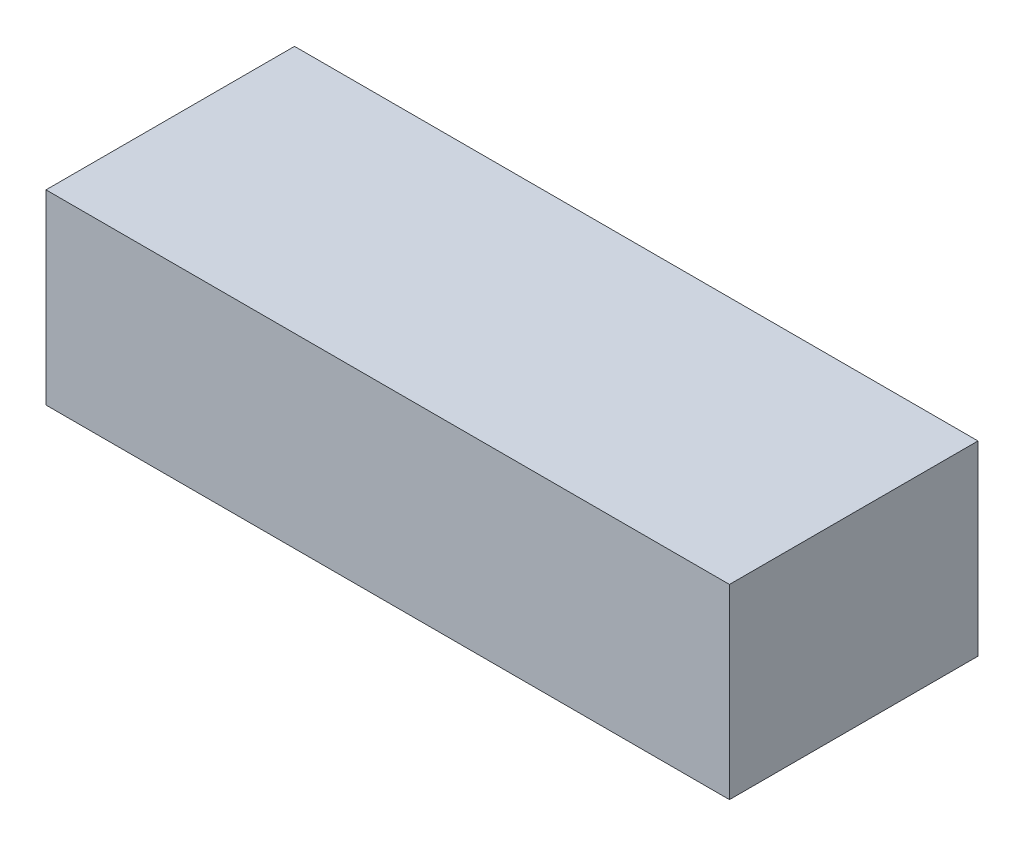
ISO-10303-21;
HEADER;
FILE_DESCRIPTION(('STEP AP214'),'2;1');
FILE_NAME('part.step','',(''),(''),'','','');
FILE_SCHEMA(('AUTOMOTIVE_DESIGN { 1 0 10303 214 1 1 1 1 }'));
ENDSEC;
DATA;
#1=APPLICATION_CONTEXT('core data for automotive mechanical design processes');
#2=APPLICATION_PROTOCOL_DEFINITION('international standard','automotive_design',2000,#1);
#3=PRODUCT_CONTEXT('',#1,'mechanical');
#4=PRODUCT('Part','Part','',(#3));
#5=PRODUCT_RELATED_PRODUCT_CATEGORY('part','',(#4));
#6=PRODUCT_DEFINITION_FORMATION('','',#4);
#7=PRODUCT_DEFINITION_CONTEXT('part definition',#1,'design');
#8=PRODUCT_DEFINITION('design','',#6,#7);
#9=PRODUCT_DEFINITION_SHAPE('','',#8);
#10=(LENGTH_UNIT() NAMED_UNIT(*) SI_UNIT(.MILLI.,.METRE.));
#11=(NAMED_UNIT(*) PLANE_ANGLE_UNIT() SI_UNIT($,.RADIAN.));
#12=(NAMED_UNIT(*) SI_UNIT($,.STERADIAN.) SOLID_ANGLE_UNIT());
#13=UNCERTAINTY_MEASURE_WITH_UNIT(LENGTH_MEASURE(1.E-05),#10,'distance_accuracy_value','');
#14=(GEOMETRIC_REPRESENTATION_CONTEXT(3) GLOBAL_UNCERTAINTY_ASSIGNED_CONTEXT((#13)) GLOBAL_UNIT_ASSIGNED_CONTEXT((#10,
#11,#12)) REPRESENTATION_CONTEXT('',''));
#15=CARTESIAN_POINT('',(0.,0.,0.));
#16=DIRECTION('',(0.,0.,1.));
#17=DIRECTION('',(1.,0.,0.));
#18=AXIS2_PLACEMENT_3D('',#15,#16,#17);
#19=CARTESIAN_POINT('',(22.,-6.,8.));
#20=DIRECTION('',(-1.,0.,0.));
#21=DIRECTION('',(0.,0.,1.));
#22=AXIS2_PLACEMENT_3D('',#19,#20,#21);
#23=PLANE('',#22);
#24=DIRECTION('',(0.,1.,0.));
#25=VECTOR('',#24,1.);
#26=CARTESIAN_POINT('',(22.,-6.,-8.));
#27=LINE('',#26,#25);
#28=CARTESIAN_POINT('',(22.,-6.,-8.));
#29=VERTEX_POINT('',#28);
#30=CARTESIAN_POINT('',(22.,6.,-8.));
#31=VERTEX_POINT('',#30);
#32=EDGE_CURVE('E102',#29,#31,#27,.T.);
#33=ORIENTED_EDGE('',*,*,#32,.T.);
#34=DIRECTION('',(0.,0.,-1.));
#35=VECTOR('',#34,1.);
#36=CARTESIAN_POINT('',(22.,6.,8.));
#37=LINE('',#36,#35);
#38=CARTESIAN_POINT('',(22.,6.,8.));
#39=VERTEX_POINT('',#38);
#40=EDGE_CURVE('E11',#39,#31,#37,.T.);
#41=ORIENTED_EDGE('',*,*,#40,.F.);
#42=DIRECTION('',(0.,1.,0.));
#43=VECTOR('',#42,1.);
#44=CARTESIAN_POINT('',(22.,-6.,8.));
#45=LINE('',#44,#43);
#46=CARTESIAN_POINT('',(22.,-6.,8.));
#47=VERTEX_POINT('',#46);
#48=EDGE_CURVE('E95',#47,#39,#45,.T.);
#49=ORIENTED_EDGE('',*,*,#48,.F.);
#50=DIRECTION('',(0.,0.,-1.));
#51=VECTOR('',#50,1.);
#52=CARTESIAN_POINT('',(22.,-6.,8.));
#53=LINE('',#52,#51);
#54=EDGE_CURVE('E99',#47,#29,#53,.T.);
#55=ORIENTED_EDGE('',*,*,#54,.T.);
#56=EDGE_LOOP('',(#33,#41,#49,#55));
#57=FACE_BOUND('',#56,.T.);
#58=ADVANCED_FACE('F41',(#57),#23,.F.);
#59=CARTESIAN_POINT('',(-22.,6.,8.));
#60=DIRECTION('',(0.,-1.,0.));
#61=DIRECTION('',(0.,0.,-1.));
#62=AXIS2_PLACEMENT_3D('',#59,#60,#61);
#63=PLANE('',#62);
#64=DIRECTION('',(-1.,0.,0.));
#65=VECTOR('',#64,1.);
#66=CARTESIAN_POINT('',(-22.,6.,-8.));
#67=LINE('',#66,#65);
#68=CARTESIAN_POINT('',(-22.,6.,-8.));
#69=VERTEX_POINT('',#68);
#70=EDGE_CURVE('E96',#31,#69,#67,.T.);
#71=ORIENTED_EDGE('',*,*,#70,.T.);
#72=DIRECTION('',(0.,0.,-1.));
#73=VECTOR('',#72,1.);
#74=CARTESIAN_POINT('',(-22.,6.,8.));
#75=LINE('',#74,#73);
#76=CARTESIAN_POINT('',(-22.,6.,8.));
#77=VERTEX_POINT('',#76);
#78=EDGE_CURVE('E47',#77,#69,#75,.T.);
#79=ORIENTED_EDGE('',*,*,#78,.F.);
#80=DIRECTION('',(-1.,0.,0.));
#81=VECTOR('',#80,1.);
#82=CARTESIAN_POINT('',(-22.,6.,8.));
#83=LINE('',#82,#81);
#84=EDGE_CURVE('E87',#39,#77,#83,.T.);
#85=ORIENTED_EDGE('',*,*,#84,.F.);
#86=ORIENTED_EDGE('',*,*,#40,.T.);
#87=EDGE_LOOP('',(#71,#79,#85,#86));
#88=FACE_BOUND('',#87,.T.);
#89=ADVANCED_FACE('F92',(#88),#63,.F.);
#90=CARTESIAN_POINT('',(-22.,-6.,8.));
#91=DIRECTION('',(1.,0.,0.));
#92=DIRECTION('',(0.,0.,-1.));
#93=AXIS2_PLACEMENT_3D('',#90,#91,#92);
#94=PLANE('',#93);
#95=DIRECTION('',(0.,-1.,0.));
#96=VECTOR('',#95,1.);
#97=CARTESIAN_POINT('',(-22.,-6.,-8.));
#98=LINE('',#97,#96);
#99=CARTESIAN_POINT('',(-22.,-6.,-8.));
#100=VERTEX_POINT('',#99);
#101=EDGE_CURVE('E74',#69,#100,#98,.T.);
#102=ORIENTED_EDGE('',*,*,#101,.T.);
#103=DIRECTION('',(0.,0.,-1.));
#104=VECTOR('',#103,1.);
#105=CARTESIAN_POINT('',(-22.,-6.,8.));
#106=LINE('',#105,#104);
#107=CARTESIAN_POINT('',(-22.,-6.,8.));
#108=VERTEX_POINT('',#107);
#109=EDGE_CURVE('E100',#108,#100,#106,.T.);
#110=ORIENTED_EDGE('',*,*,#109,.F.);
#111=DIRECTION('',(0.,-1.,0.));
#112=VECTOR('',#111,1.);
#113=CARTESIAN_POINT('',(-22.,-6.,8.));
#114=LINE('',#113,#112);
#115=EDGE_CURVE('E89',#77,#108,#114,.T.);
#116=ORIENTED_EDGE('',*,*,#115,.F.);
#117=ORIENTED_EDGE('',*,*,#78,.T.);
#118=EDGE_LOOP('',(#102,#110,#116,#117));
#119=FACE_BOUND('',#118,.T.);
#120=ADVANCED_FACE('F98',(#119),#94,.F.);
#121=CARTESIAN_POINT('',(-22.,-6.,8.));
#122=DIRECTION('',(0.,1.,0.));
#123=DIRECTION('',(0.,0.,1.));
#124=AXIS2_PLACEMENT_3D('',#121,#122,#123);
#125=PLANE('',#124);
#126=DIRECTION('',(1.,0.,0.));
#127=VECTOR('',#126,1.);
#128=CARTESIAN_POINT('',(-22.,-6.,-8.));
#129=LINE('',#128,#127);
#130=EDGE_CURVE('E76',#100,#29,#129,.T.);
#131=ORIENTED_EDGE('',*,*,#130,.T.);
#132=ORIENTED_EDGE('',*,*,#54,.F.);
#133=DIRECTION('',(1.,0.,0.));
#134=VECTOR('',#133,1.);
#135=CARTESIAN_POINT('',(-22.,-6.,8.));
#136=LINE('',#135,#134);
#137=EDGE_CURVE('E60',#108,#47,#136,.T.);
#138=ORIENTED_EDGE('',*,*,#137,.F.);
#139=ORIENTED_EDGE('',*,*,#109,.T.);
#140=EDGE_LOOP('',(#131,#132,#138,#139));
#141=FACE_BOUND('',#140,.T.);
#142=ADVANCED_FACE('F112',(#141),#125,.F.);
#143=CARTESIAN_POINT('',(0.,0.,8.));
#144=DIRECTION('',(0.,0.,-1.));
#145=DIRECTION('',(-1.,0.,0.));
#146=AXIS2_PLACEMENT_3D('',#143,#144,#145);
#147=PLANE('',#146);
#148=ORIENTED_EDGE('',*,*,#48,.T.);
#149=ORIENTED_EDGE('',*,*,#84,.T.);
#150=ORIENTED_EDGE('',*,*,#115,.T.);
#151=ORIENTED_EDGE('',*,*,#137,.T.);
#152=EDGE_LOOP('',(#148,#149,#150,#151));
#153=FACE_BOUND('',#152,.T.);
#154=ADVANCED_FACE('F86',(#153),#147,.F.);
#155=CARTESIAN_POINT('',(0.,0.,-8.));
#156=DIRECTION('',(0.,0.,-1.));
#157=DIRECTION('',(-1.,0.,0.));
#158=AXIS2_PLACEMENT_3D('',#155,#156,#157);
#159=PLANE('',#158);
#160=ORIENTED_EDGE('',*,*,#32,.F.);
#161=ORIENTED_EDGE('',*,*,#130,.F.);
#162=ORIENTED_EDGE('',*,*,#101,.F.);
#163=ORIENTED_EDGE('',*,*,#70,.F.);
#164=EDGE_LOOP('',(#160,#161,#162,#163));
#165=FACE_BOUND('',#164,.T.);
#166=ADVANCED_FACE('F111',(#165),#159,.T.);
#167=CLOSED_SHELL('',(#58,#89,#120,#142,#154,#166));
#168=MANIFOLD_SOLID_BREP('B2',#167);
#169=ADVANCED_BREP_SHAPE_REPRESENTATION('',(#18,#168),#14);
#170=SHAPE_DEFINITION_REPRESENTATION(#9,#169);
ENDSEC;
END-ISO-10303-21;
